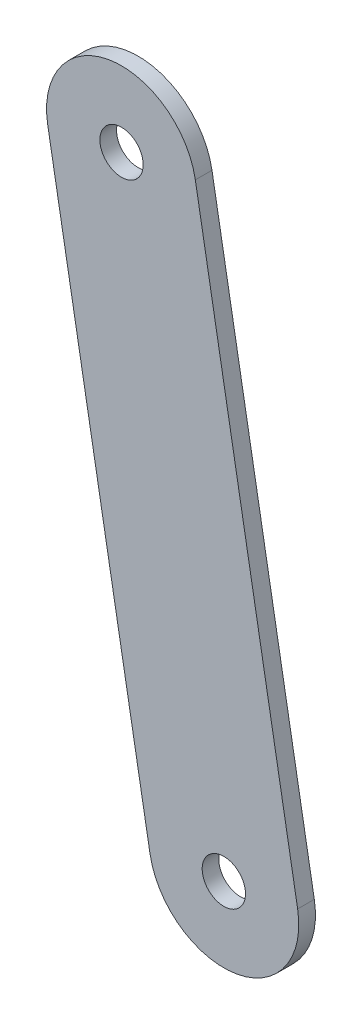
ISO-10303-21;
HEADER;
FILE_DESCRIPTION(('STEP AP214'),'2;1');
FILE_NAME('part.step','',(''),(''),'','','');
FILE_SCHEMA(('AUTOMOTIVE_DESIGN { 1 0 10303 214 1 1 1 1 }'));
ENDSEC;
DATA;
#1=APPLICATION_CONTEXT('core data for automotive mechanical design processes');
#2=APPLICATION_PROTOCOL_DEFINITION('international standard','automotive_design',2000,#1);
#3=PRODUCT_CONTEXT('',#1,'mechanical');
#4=PRODUCT('Part','Part','',(#3));
#5=PRODUCT_RELATED_PRODUCT_CATEGORY('part','',(#4));
#6=PRODUCT_DEFINITION_FORMATION('','',#4);
#7=PRODUCT_DEFINITION_CONTEXT('part definition',#1,'design');
#8=PRODUCT_DEFINITION('design','',#6,#7);
#9=PRODUCT_DEFINITION_SHAPE('','',#8);
#10=(LENGTH_UNIT() NAMED_UNIT(*) SI_UNIT(.MILLI.,.METRE.));
#11=(NAMED_UNIT(*) PLANE_ANGLE_UNIT() SI_UNIT($,.RADIAN.));
#12=(NAMED_UNIT(*) SI_UNIT($,.STERADIAN.) SOLID_ANGLE_UNIT());
#13=UNCERTAINTY_MEASURE_WITH_UNIT(LENGTH_MEASURE(1.E-05),#10,'distance_accuracy_value','');
#14=(GEOMETRIC_REPRESENTATION_CONTEXT(3) GLOBAL_UNCERTAINTY_ASSIGNED_CONTEXT((#13)) GLOBAL_UNIT_ASSIGNED_CONTEXT((#10,
#11,#12)) REPRESENTATION_CONTEXT('',''));
#15=CARTESIAN_POINT('',(0.,0.,0.));
#16=DIRECTION('',(0.,0.,1.));
#17=DIRECTION('',(1.,0.,0.));
#18=AXIS2_PLACEMENT_3D('',#15,#16,#17);
#19=CARTESIAN_POINT('',(-22.,-68.,-2.4));
#20=DIRECTION('',(0.,0.,1.));
#21=DIRECTION('',(1.,0.,0.));
#22=AXIS2_PLACEMENT_3D('',#19,#20,#21);
#23=PLANE('',#22);
#24=CARTESIAN_POINT('',(-22.,-68.,-2.4));
#25=DIRECTION('',(0.,0.,1.));
#26=DIRECTION('',(1.,0.,0.));
#27=AXIS2_PLACEMENT_3D('',#24,#25,#26);
#28=CIRCLE('',#27,2.6);
#29=CARTESIAN_POINT('',(-19.4,-68.,-2.4));
#30=VERTEX_POINT('',#29);
#31=EDGE_CURVE('E100',#30,#30,#28,.T.);
#32=ORIENTED_EDGE('',*,*,#31,.F.);
#33=EDGE_LOOP('',(#32));
#34=FACE_BOUND('',#33,.T.);
#35=CARTESIAN_POINT('',(-22.,-68.,-2.4));
#36=DIRECTION('',(0.,0.,1.));
#37=DIRECTION('',(1.,0.,0.));
#38=AXIS2_PLACEMENT_3D('',#35,#36,#37);
#39=CIRCLE('',#38,9.);
#40=CARTESIAN_POINT('',(-13.1367302228901,-66.4371664009976,-2.4));
#41=VERTEX_POINT('',#40);
#42=CARTESIAN_POINT('',(-30.8632697771099,-69.5628335990024,-2.4));
#43=VERTEX_POINT('',#42);
#44=EDGE_CURVE('E85',#41,#43,#39,.T.);
#45=ORIENTED_EDGE('',*,*,#44,.T.);
#46=DIRECTION('',(0.17364817766693,-0.984807753012208,0.));
#47=VECTOR('',#46,1.);
#48=CARTESIAN_POINT('',(-30.8632697771099,-69.5628335990024,-2.4));
#49=LINE('',#48,#47);
#50=CARTESIAN_POINT('',(-18.5776612071745,-139.237982124616,-2.4));
#51=VERTEX_POINT('',#50);
#52=EDGE_CURVE('E80',#43,#51,#49,.T.);
#53=ORIENTED_EDGE('',*,*,#52,.T.);
#54=CARTESIAN_POINT('',(-9.71439143006466,-137.675148525614,-2.4));
#55=DIRECTION('',(0.,0.,1.));
#56=DIRECTION('',(1.,0.,0.));
#57=AXIS2_PLACEMENT_3D('',#54,#55,#56);
#58=CIRCLE('',#57,9.);
#59=CARTESIAN_POINT('',(-0.851121652954792,-136.112314926611,-2.4));
#60=VERTEX_POINT('',#59);
#61=EDGE_CURVE('E83',#51,#60,#58,.T.);
#62=ORIENTED_EDGE('',*,*,#61,.T.);
#63=DIRECTION('',(-0.17364817766693,0.984807753012208,0.));
#64=VECTOR('',#63,1.);
#65=CARTESIAN_POINT('',(-0.851121652954799,-136.112314926611,-2.4));
#66=LINE('',#65,#64);
#67=EDGE_CURVE('E50',#60,#41,#66,.T.);
#68=ORIENTED_EDGE('',*,*,#67,.T.);
#69=EDGE_LOOP('',(#45,#53,#62,#68));
#70=FACE_BOUND('',#69,.T.);
#71=CARTESIAN_POINT('',(-9.71439143006466,-137.675148525614,-2.4));
#72=DIRECTION('',(0.,0.,1.));
#73=DIRECTION('',(1.,0.,0.));
#74=AXIS2_PLACEMENT_3D('',#71,#72,#73);
#75=CIRCLE('',#74,2.59999999999999);
#76=CARTESIAN_POINT('',(-7.11439143006467,-137.675148525614,-2.4));
#77=VERTEX_POINT('',#76);
#78=EDGE_CURVE('E115',#77,#77,#75,.T.);
#79=ORIENTED_EDGE('',*,*,#78,.F.);
#80=EDGE_LOOP('',(#79));
#81=FACE_BOUND('',#80,.T.);
#82=ADVANCED_FACE('F33',(#34,#70,#81),#23,.T.);
#83=CARTESIAN_POINT('',(-22.,-68.,-4.4));
#84=DIRECTION('',(0.,0.,1.));
#85=DIRECTION('',(1.,0.,0.));
#86=AXIS2_PLACEMENT_3D('',#83,#84,#85);
#87=PLANE('',#86);
#88=CARTESIAN_POINT('',(-22.,-68.,-4.4));
#89=DIRECTION('',(0.,0.,1.));
#90=DIRECTION('',(1.,0.,0.));
#91=AXIS2_PLACEMENT_3D('',#88,#89,#90);
#92=CIRCLE('',#91,9.);
#93=CARTESIAN_POINT('',(-13.1367302228901,-66.4371664009976,-4.4));
#94=VERTEX_POINT('',#93);
#95=CARTESIAN_POINT('',(-30.8632697771099,-69.5628335990024,-4.4));
#96=VERTEX_POINT('',#95);
#97=EDGE_CURVE('E97',#94,#96,#92,.T.);
#98=ORIENTED_EDGE('',*,*,#97,.F.);
#99=DIRECTION('',(-0.17364817766693,0.984807753012208,0.));
#100=VECTOR('',#99,1.);
#101=CARTESIAN_POINT('',(-0.851121652954799,-136.112314926611,-4.4));
#102=LINE('',#101,#100);
#103=CARTESIAN_POINT('',(-0.851121652954792,-136.112314926611,-4.4));
#104=VERTEX_POINT('',#103);
#105=EDGE_CURVE('E73',#104,#94,#102,.T.);
#106=ORIENTED_EDGE('',*,*,#105,.F.);
#107=CARTESIAN_POINT('',(-9.71439143006466,-137.675148525614,-4.4));
#108=DIRECTION('',(0.,0.,1.));
#109=DIRECTION('',(1.,0.,0.));
#110=AXIS2_PLACEMENT_3D('',#107,#108,#109);
#111=CIRCLE('',#110,9.);
#112=CARTESIAN_POINT('',(-18.5776612071745,-139.237982124616,-4.4));
#113=VERTEX_POINT('',#112);
#114=EDGE_CURVE('E67',#113,#104,#111,.T.);
#115=ORIENTED_EDGE('',*,*,#114,.F.);
#116=DIRECTION('',(0.17364817766693,-0.984807753012208,0.));
#117=VECTOR('',#116,1.);
#118=CARTESIAN_POINT('',(-30.8632697771099,-69.5628335990024,-4.4));
#119=LINE('',#118,#117);
#120=EDGE_CURVE('E89',#96,#113,#119,.T.);
#121=ORIENTED_EDGE('',*,*,#120,.F.);
#122=EDGE_LOOP('',(#98,#106,#115,#121));
#123=FACE_BOUND('',#122,.T.);
#124=CARTESIAN_POINT('',(-22.,-68.,-4.4));
#125=DIRECTION('',(0.,0.,1.));
#126=DIRECTION('',(1.,0.,0.));
#127=AXIS2_PLACEMENT_3D('',#124,#125,#126);
#128=CIRCLE('',#127,2.6);
#129=CARTESIAN_POINT('',(-19.4,-68.,-4.4));
#130=VERTEX_POINT('',#129);
#131=EDGE_CURVE('E112',#130,#130,#128,.T.);
#132=ORIENTED_EDGE('',*,*,#131,.T.);
#133=EDGE_LOOP('',(#132));
#134=FACE_BOUND('',#133,.T.);
#135=CARTESIAN_POINT('',(-9.71439143006466,-137.675148525614,-4.4));
#136=DIRECTION('',(0.,0.,1.));
#137=DIRECTION('',(1.,0.,0.));
#138=AXIS2_PLACEMENT_3D('',#135,#136,#137);
#139=CIRCLE('',#138,2.59999999999999);
#140=CARTESIAN_POINT('',(-7.11439143006467,-137.675148525614,-4.4));
#141=VERTEX_POINT('',#140);
#142=EDGE_CURVE('E118',#141,#141,#139,.T.);
#143=ORIENTED_EDGE('',*,*,#142,.T.);
#144=EDGE_LOOP('',(#143));
#145=FACE_BOUND('',#144,.T.);
#146=ADVANCED_FACE('F108',(#123,#134,#145),#87,.F.);
#147=CARTESIAN_POINT('',(-22.,-68.,-2.4));
#148=DIRECTION('',(0.,0.,-1.));
#149=DIRECTION('',(-1.,0.,0.));
#150=AXIS2_PLACEMENT_3D('',#147,#148,#149);
#151=CYLINDRICAL_SURFACE('',#150,9.);
#152=ORIENTED_EDGE('',*,*,#97,.T.);
#153=DIRECTION('',(0.,0.,-1.));
#154=VECTOR('',#153,1.);
#155=CARTESIAN_POINT('',(-30.8632697771099,-69.5628335990024,-2.4));
#156=LINE('',#155,#154);
#157=EDGE_CURVE('E11',#43,#96,#156,.T.);
#158=ORIENTED_EDGE('',*,*,#157,.F.);
#159=ORIENTED_EDGE('',*,*,#44,.F.);
#160=DIRECTION('',(0.,0.,-1.));
#161=VECTOR('',#160,1.);
#162=CARTESIAN_POINT('',(-13.1367302228901,-66.4371664009976,-2.4));
#163=LINE('',#162,#161);
#164=EDGE_CURVE('E93',#41,#94,#163,.T.);
#165=ORIENTED_EDGE('',*,*,#164,.T.);
#166=EDGE_LOOP('',(#152,#158,#159,#165));
#167=FACE_BOUND('',#166,.T.);
#168=ADVANCED_FACE('F35',(#167),#151,.T.);
#169=CARTESIAN_POINT('',(-30.8632697771099,-69.5628335990024,-2.4));
#170=DIRECTION('',(0.984807753012208,0.17364817766693,0.));
#171=DIRECTION('',(-0.17364817766693,0.984807753012208,0.));
#172=AXIS2_PLACEMENT_3D('',#169,#170,#171);
#173=PLANE('',#172);
#174=ORIENTED_EDGE('',*,*,#120,.T.);
#175=DIRECTION('',(0.,0.,-1.));
#176=VECTOR('',#175,1.);
#177=CARTESIAN_POINT('',(-18.5776612071745,-139.237982124616,-2.4));
#178=LINE('',#177,#176);
#179=EDGE_CURVE('E42',#51,#113,#178,.T.);
#180=ORIENTED_EDGE('',*,*,#179,.F.);
#181=ORIENTED_EDGE('',*,*,#52,.F.);
#182=ORIENTED_EDGE('',*,*,#157,.T.);
#183=EDGE_LOOP('',(#174,#180,#181,#182));
#184=FACE_BOUND('',#183,.T.);
#185=ADVANCED_FACE('F88',(#184),#173,.F.);
#186=CARTESIAN_POINT('',(-9.71439143006466,-137.675148525614,-2.4));
#187=DIRECTION('',(0.,0.,-1.));
#188=DIRECTION('',(-1.,0.,0.));
#189=AXIS2_PLACEMENT_3D('',#186,#187,#188);
#190=CYLINDRICAL_SURFACE('',#189,9.);
#191=ORIENTED_EDGE('',*,*,#114,.T.);
#192=DIRECTION('',(0.,0.,-1.));
#193=VECTOR('',#192,1.);
#194=CARTESIAN_POINT('',(-0.851121652954792,-136.112314926611,-2.4));
#195=LINE('',#194,#193);
#196=EDGE_CURVE('E90',#60,#104,#195,.T.);
#197=ORIENTED_EDGE('',*,*,#196,.F.);
#198=ORIENTED_EDGE('',*,*,#61,.F.);
#199=ORIENTED_EDGE('',*,*,#179,.T.);
#200=EDGE_LOOP('',(#191,#197,#198,#199));
#201=FACE_BOUND('',#200,.T.);
#202=ADVANCED_FACE('F91',(#201),#190,.T.);
#203=CARTESIAN_POINT('',(-0.851121652954799,-136.112314926611,-2.4));
#204=DIRECTION('',(-0.984807753012208,-0.17364817766693,0.));
#205=DIRECTION('',(0.17364817766693,-0.984807753012208,0.));
#206=AXIS2_PLACEMENT_3D('',#203,#204,#205);
#207=PLANE('',#206);
#208=ORIENTED_EDGE('',*,*,#105,.T.);
#209=ORIENTED_EDGE('',*,*,#164,.F.);
#210=ORIENTED_EDGE('',*,*,#67,.F.);
#211=ORIENTED_EDGE('',*,*,#196,.T.);
#212=EDGE_LOOP('',(#208,#209,#210,#211));
#213=FACE_BOUND('',#212,.T.);
#214=ADVANCED_FACE('F105',(#213),#207,.F.);
#215=CARTESIAN_POINT('',(-22.,-68.,-2.4));
#216=DIRECTION('',(0.,0.,-1.));
#217=DIRECTION('',(-1.,0.,0.));
#218=AXIS2_PLACEMENT_3D('',#215,#216,#217);
#219=CYLINDRICAL_SURFACE('',#218,2.6);
#220=ORIENTED_EDGE('',*,*,#31,.T.);
#221=EDGE_LOOP('',(#220));
#222=FACE_BOUND('',#221,.T.);
#223=ORIENTED_EDGE('',*,*,#131,.F.);
#224=EDGE_LOOP('',(#223));
#225=FACE_BOUND('',#224,.T.);
#226=ADVANCED_FACE('F135',(#222,#225),#219,.F.);
#227=CARTESIAN_POINT('',(-9.71439143006466,-137.675148525614,-2.4));
#228=DIRECTION('',(0.,0.,-1.));
#229=DIRECTION('',(-1.,0.,0.));
#230=AXIS2_PLACEMENT_3D('',#227,#228,#229);
#231=CYLINDRICAL_SURFACE('',#230,2.59999999999999);
#232=ORIENTED_EDGE('',*,*,#78,.T.);
#233=EDGE_LOOP('',(#232));
#234=FACE_BOUND('',#233,.T.);
#235=ORIENTED_EDGE('',*,*,#142,.F.);
#236=EDGE_LOOP('',(#235));
#237=FACE_BOUND('',#236,.T.);
#238=ADVANCED_FACE('F124',(#234,#237),#231,.F.);
#239=CLOSED_SHELL('',(#82,#146,#168,#185,#202,#214,#226,#238));
#240=MANIFOLD_SOLID_BREP('B2',#239);
#241=ADVANCED_BREP_SHAPE_REPRESENTATION('',(#18,#240),#14);
#242=SHAPE_DEFINITION_REPRESENTATION(#9,#241);
ENDSEC;
END-ISO-10303-21;
